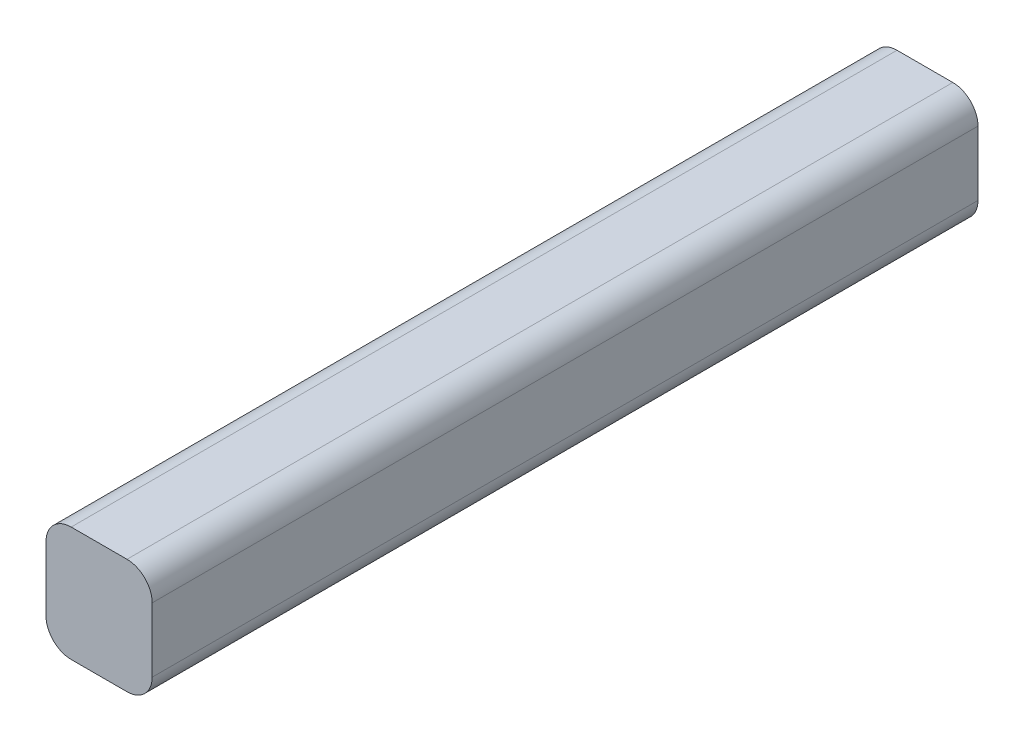
ISO-10303-21;
HEADER;
FILE_DESCRIPTION(('STEP AP214'),'2;1');
FILE_NAME('part.step','',(''),(''),'','','');
FILE_SCHEMA(('AUTOMOTIVE_DESIGN { 1 0 10303 214 1 1 1 1 }'));
ENDSEC;
DATA;
#1=APPLICATION_CONTEXT('core data for automotive mechanical design processes');
#2=APPLICATION_PROTOCOL_DEFINITION('international standard','automotive_design',2000,#1);
#3=PRODUCT_CONTEXT('',#1,'mechanical');
#4=PRODUCT('Part','Part','',(#3));
#5=PRODUCT_RELATED_PRODUCT_CATEGORY('part','',(#4));
#6=PRODUCT_DEFINITION_FORMATION('','',#4);
#7=PRODUCT_DEFINITION_CONTEXT('part definition',#1,'design');
#8=PRODUCT_DEFINITION('design','',#6,#7);
#9=PRODUCT_DEFINITION_SHAPE('','',#8);
#10=(LENGTH_UNIT() NAMED_UNIT(*) SI_UNIT(.MILLI.,.METRE.));
#11=(NAMED_UNIT(*) PLANE_ANGLE_UNIT() SI_UNIT($,.RADIAN.));
#12=(NAMED_UNIT(*) SI_UNIT($,.STERADIAN.) SOLID_ANGLE_UNIT());
#13=UNCERTAINTY_MEASURE_WITH_UNIT(LENGTH_MEASURE(1.E-05),#10,'distance_accuracy_value','');
#14=(GEOMETRIC_REPRESENTATION_CONTEXT(3) GLOBAL_UNCERTAINTY_ASSIGNED_CONTEXT((#13)) GLOBAL_UNIT_ASSIGNED_CONTEXT((#10,
#11,#12)) REPRESENTATION_CONTEXT('',''));
#15=CARTESIAN_POINT('',(0.,0.,0.));
#16=DIRECTION('',(0.,0.,1.));
#17=DIRECTION('',(1.,0.,0.));
#18=AXIS2_PLACEMENT_3D('',#15,#16,#17);
#19=CARTESIAN_POINT('',(-19.39,22.78,328.));
#20=DIRECTION('',(0.,-1.,0.));
#21=DIRECTION('',(0.,0.,-1.));
#22=AXIS2_PLACEMENT_3D('',#19,#20,#21);
#23=PLANE('',#22);
#24=DIRECTION('',(-1.,0.,0.));
#25=VECTOR('',#24,1.);
#26=CARTESIAN_POINT('',(-19.39,22.78,0.));
#27=LINE('',#26,#25);
#28=CARTESIAN_POINT('',(12.78,22.78,0.));
#29=VERTEX_POINT('',#28);
#30=CARTESIAN_POINT('',(-9.39,22.78,0.));
#31=VERTEX_POINT('',#30);
#32=EDGE_CURVE('E146',#29,#31,#27,.T.);
#33=ORIENTED_EDGE('',*,*,#32,.T.);
#34=DIRECTION('',(0.,0.,-1.));
#35=VECTOR('',#34,1.);
#36=CARTESIAN_POINT('',(-9.39,22.78,328.));
#37=LINE('',#36,#35);
#38=CARTESIAN_POINT('',(-9.39,22.78,328.));
#39=VERTEX_POINT('',#38);
#40=EDGE_CURVE('E180',#31,#39,#37,.F.);
#41=ORIENTED_EDGE('',*,*,#40,.T.);
#42=DIRECTION('',(-1.,0.,0.));
#43=VECTOR('',#42,1.);
#44=CARTESIAN_POINT('',(-19.39,22.78,328.));
#45=LINE('',#44,#43);
#46=CARTESIAN_POINT('',(12.78,22.78,328.));
#47=VERTEX_POINT('',#46);
#48=EDGE_CURVE('E144',#47,#39,#45,.T.);
#49=ORIENTED_EDGE('',*,*,#48,.F.);
#50=DIRECTION('',(0.,0.,-1.));
#51=VECTOR('',#50,1.);
#52=CARTESIAN_POINT('',(12.78,22.78,328.));
#53=LINE('',#52,#51);
#54=EDGE_CURVE('E176',#47,#29,#53,.T.);
#55=ORIENTED_EDGE('',*,*,#54,.T.);
#56=EDGE_LOOP('',(#33,#41,#49,#55));
#57=FACE_BOUND('',#56,.T.);
#58=ADVANCED_FACE('F45',(#57),#23,.F.);
#59=CARTESIAN_POINT('',(-19.39,-22.79,328.));
#60=DIRECTION('',(1.,0.,0.));
#61=DIRECTION('',(0.,0.,-1.));
#62=AXIS2_PLACEMENT_3D('',#59,#60,#61);
#63=PLANE('',#62);
#64=DIRECTION('',(0.,-1.,0.));
#65=VECTOR('',#64,1.);
#66=CARTESIAN_POINT('',(-19.39,-22.79,0.));
#67=LINE('',#66,#65);
#68=CARTESIAN_POINT('',(-19.39,12.78,0.));
#69=VERTEX_POINT('',#68);
#70=CARTESIAN_POINT('',(-19.39,-12.79,0.));
#71=VERTEX_POINT('',#70);
#72=EDGE_CURVE('E140',#69,#71,#67,.T.);
#73=ORIENTED_EDGE('',*,*,#72,.T.);
#74=DIRECTION('',(0.,0.,-1.));
#75=VECTOR('',#74,1.);
#76=CARTESIAN_POINT('',(-19.39,-12.79,328.));
#77=LINE('',#76,#75);
#78=CARTESIAN_POINT('',(-19.39,-12.79,328.));
#79=VERTEX_POINT('',#78);
#80=EDGE_CURVE('E116',#71,#79,#77,.F.);
#81=ORIENTED_EDGE('',*,*,#80,.T.);
#82=DIRECTION('',(0.,-1.,0.));
#83=VECTOR('',#82,1.);
#84=CARTESIAN_POINT('',(-19.39,-22.79,328.));
#85=LINE('',#84,#83);
#86=CARTESIAN_POINT('',(-19.39,12.78,328.));
#87=VERTEX_POINT('',#86);
#88=EDGE_CURVE('E199',#87,#79,#85,.T.);
#89=ORIENTED_EDGE('',*,*,#88,.F.);
#90=DIRECTION('',(0.,0.,-1.));
#91=VECTOR('',#90,1.);
#92=CARTESIAN_POINT('',(-19.39,12.78,328.));
#93=LINE('',#92,#91);
#94=EDGE_CURVE('E122',#87,#69,#93,.T.);
#95=ORIENTED_EDGE('',*,*,#94,.T.);
#96=EDGE_LOOP('',(#73,#81,#89,#95));
#97=FACE_BOUND('',#96,.T.);
#98=ADVANCED_FACE('F220',(#97),#63,.F.);
#99=CARTESIAN_POINT('',(22.78,-22.79,328.));
#100=DIRECTION('',(0.,1.,0.));
#101=DIRECTION('',(-1.,0.,0.));
#102=AXIS2_PLACEMENT_3D('',#99,#100,#101);
#103=PLANE('',#102);
#104=DIRECTION('',(1.,0.,0.));
#105=VECTOR('',#104,1.);
#106=CARTESIAN_POINT('',(22.78,-22.79,328.));
#107=LINE('',#106,#105);
#108=CARTESIAN_POINT('',(-9.38999999999998,-22.79,328.));
#109=VERTEX_POINT('',#108);
#110=CARTESIAN_POINT('',(12.78,-22.79,328.));
#111=VERTEX_POINT('',#110);
#112=EDGE_CURVE('E131',#109,#111,#107,.T.);
#113=ORIENTED_EDGE('',*,*,#112,.F.);
#114=DIRECTION('',(0.,0.,-1.));
#115=VECTOR('',#114,1.);
#116=CARTESIAN_POINT('',(-9.39,-22.79,328.));
#117=LINE('',#116,#115);
#118=CARTESIAN_POINT('',(-9.38999999999998,-22.79,0.));
#119=VERTEX_POINT('',#118);
#120=EDGE_CURVE('E115',#109,#119,#117,.T.);
#121=ORIENTED_EDGE('',*,*,#120,.T.);
#122=DIRECTION('',(1.,0.,0.));
#123=VECTOR('',#122,1.);
#124=CARTESIAN_POINT('',(22.78,-22.79,0.));
#125=LINE('',#124,#123);
#126=CARTESIAN_POINT('',(12.78,-22.79,0.));
#127=VERTEX_POINT('',#126);
#128=EDGE_CURVE('E129',#119,#127,#125,.T.);
#129=ORIENTED_EDGE('',*,*,#128,.T.);
#130=DIRECTION('',(0.,0.,-1.));
#131=VECTOR('',#130,1.);
#132=CARTESIAN_POINT('',(12.78,-22.79,328.));
#133=LINE('',#132,#131);
#134=EDGE_CURVE('E134',#127,#111,#133,.F.);
#135=ORIENTED_EDGE('',*,*,#134,.T.);
#136=EDGE_LOOP('',(#113,#121,#129,#135));
#137=FACE_BOUND('',#136,.T.);
#138=ADVANCED_FACE('F128',(#137),#103,.F.);
#139=CARTESIAN_POINT('',(22.78,22.78,328.));
#140=DIRECTION('',(-1.,0.,0.));
#141=DIRECTION('',(0.,-1.,0.));
#142=AXIS2_PLACEMENT_3D('',#139,#140,#141);
#143=PLANE('',#142);
#144=DIRECTION('',(0.,1.,0.));
#145=VECTOR('',#144,1.);
#146=CARTESIAN_POINT('',(22.78,22.78,0.));
#147=LINE('',#146,#145);
#148=CARTESIAN_POINT('',(22.78,-12.79,0.));
#149=VERTEX_POINT('',#148);
#150=CARTESIAN_POINT('',(22.78,12.78,0.));
#151=VERTEX_POINT('',#150);
#152=EDGE_CURVE('E139',#149,#151,#147,.T.);
#153=ORIENTED_EDGE('',*,*,#152,.T.);
#154=DIRECTION('',(0.,0.,-1.));
#155=VECTOR('',#154,1.);
#156=CARTESIAN_POINT('',(22.78,12.78,328.));
#157=LINE('',#156,#155);
#158=CARTESIAN_POINT('',(22.78,12.78,328.));
#159=VERTEX_POINT('',#158);
#160=EDGE_CURVE('E11',#151,#159,#157,.F.);
#161=ORIENTED_EDGE('',*,*,#160,.T.);
#162=DIRECTION('',(0.,1.,0.));
#163=VECTOR('',#162,1.);
#164=CARTESIAN_POINT('',(22.78,22.78,328.));
#165=LINE('',#164,#163);
#166=CARTESIAN_POINT('',(22.78,-12.79,328.));
#167=VERTEX_POINT('',#166);
#168=EDGE_CURVE('E151',#167,#159,#165,.T.);
#169=ORIENTED_EDGE('',*,*,#168,.F.);
#170=DIRECTION('',(0.,0.,-1.));
#171=VECTOR('',#170,1.);
#172=CARTESIAN_POINT('',(22.78,-12.79,328.));
#173=LINE('',#172,#171);
#174=EDGE_CURVE('E54',#167,#149,#173,.T.);
#175=ORIENTED_EDGE('',*,*,#174,.T.);
#176=EDGE_LOOP('',(#153,#161,#169,#175));
#177=FACE_BOUND('',#176,.T.);
#178=ADVANCED_FACE('F185',(#177),#143,.F.);
#179=CARTESIAN_POINT('',(0.,0.,328.));
#180=DIRECTION('',(0.,0.,-1.));
#181=DIRECTION('',(-1.,0.,0.));
#182=AXIS2_PLACEMENT_3D('',#179,#180,#181);
#183=PLANE('',#182);
#184=ORIENTED_EDGE('',*,*,#88,.T.);
#185=CARTESIAN_POINT('',(-9.39,-12.79,328.));
#186=DIRECTION('',(0.,0.,-1.));
#187=DIRECTION('',(-1.,0.,0.));
#188=AXIS2_PLACEMENT_3D('',#185,#186,#187);
#189=CIRCLE('',#188,10.);
#190=EDGE_CURVE('E173',#79,#109,#189,.F.);
#191=ORIENTED_EDGE('',*,*,#190,.T.);
#192=ORIENTED_EDGE('',*,*,#112,.T.);
#193=CARTESIAN_POINT('',(12.78,-12.79,328.));
#194=DIRECTION('',(0.,0.,-1.));
#195=DIRECTION('',(-1.,0.,0.));
#196=AXIS2_PLACEMENT_3D('',#193,#194,#195);
#197=CIRCLE('',#196,10.);
#198=EDGE_CURVE('E66',#111,#167,#197,.F.);
#199=ORIENTED_EDGE('',*,*,#198,.T.);
#200=ORIENTED_EDGE('',*,*,#168,.T.);
#201=CARTESIAN_POINT('',(12.78,12.78,328.));
#202=DIRECTION('',(0.,0.,-1.));
#203=DIRECTION('',(-1.,0.,0.));
#204=AXIS2_PLACEMENT_3D('',#201,#202,#203);
#205=CIRCLE('',#204,10.);
#206=EDGE_CURVE('E167',#159,#47,#205,.F.);
#207=ORIENTED_EDGE('',*,*,#206,.T.);
#208=ORIENTED_EDGE('',*,*,#48,.T.);
#209=CARTESIAN_POINT('',(-9.39,12.78,328.));
#210=DIRECTION('',(0.,0.,-1.));
#211=DIRECTION('',(-1.,0.,0.));
#212=AXIS2_PLACEMENT_3D('',#209,#210,#211);
#213=CIRCLE('',#212,10.);
#214=EDGE_CURVE('E170',#39,#87,#213,.F.);
#215=ORIENTED_EDGE('',*,*,#214,.T.);
#216=EDGE_LOOP('',(#184,#191,#192,#199,#200,#207,#208,#215));
#217=FACE_BOUND('',#216,.T.);
#218=ADVANCED_FACE('F209',(#217),#183,.F.);
#219=CARTESIAN_POINT('',(0.,0.,0.));
#220=DIRECTION('',(0.,0.,-1.));
#221=DIRECTION('',(-1.,0.,0.));
#222=AXIS2_PLACEMENT_3D('',#219,#220,#221);
#223=PLANE('',#222);
#224=ORIENTED_EDGE('',*,*,#128,.F.);
#225=CARTESIAN_POINT('',(-9.39,-12.79,0.));
#226=DIRECTION('',(0.,0.,-1.));
#227=DIRECTION('',(-1.,0.,0.));
#228=AXIS2_PLACEMENT_3D('',#225,#226,#227);
#229=CIRCLE('',#228,10.);
#230=EDGE_CURVE('E111',#119,#71,#229,.T.);
#231=ORIENTED_EDGE('',*,*,#230,.T.);
#232=ORIENTED_EDGE('',*,*,#72,.F.);
#233=CARTESIAN_POINT('',(-9.39,12.78,0.));
#234=DIRECTION('',(0.,0.,-1.));
#235=DIRECTION('',(-1.,0.,0.));
#236=AXIS2_PLACEMENT_3D('',#233,#234,#235);
#237=CIRCLE('',#236,10.);
#238=EDGE_CURVE('E123',#69,#31,#237,.T.);
#239=ORIENTED_EDGE('',*,*,#238,.T.);
#240=ORIENTED_EDGE('',*,*,#32,.F.);
#241=CARTESIAN_POINT('',(12.78,12.78,0.));
#242=DIRECTION('',(0.,0.,-1.));
#243=DIRECTION('',(-1.,0.,0.));
#244=AXIS2_PLACEMENT_3D('',#241,#242,#243);
#245=CIRCLE('',#244,10.);
#246=EDGE_CURVE('E155',#29,#151,#245,.T.);
#247=ORIENTED_EDGE('',*,*,#246,.T.);
#248=ORIENTED_EDGE('',*,*,#152,.F.);
#249=CARTESIAN_POINT('',(12.78,-12.79,0.));
#250=DIRECTION('',(0.,0.,-1.));
#251=DIRECTION('',(-1.,0.,0.));
#252=AXIS2_PLACEMENT_3D('',#249,#250,#251);
#253=CIRCLE('',#252,10.);
#254=EDGE_CURVE('E133',#149,#127,#253,.T.);
#255=ORIENTED_EDGE('',*,*,#254,.T.);
#256=EDGE_LOOP('',(#224,#231,#232,#239,#240,#247,#248,#255));
#257=FACE_BOUND('',#256,.T.);
#258=ADVANCED_FACE('F136',(#257),#223,.T.);
#259=CARTESIAN_POINT('',(-9.39,-12.79,328.));
#260=DIRECTION('',(0.,0.,-1.));
#261=DIRECTION('',(-1.,0.,0.));
#262=AXIS2_PLACEMENT_3D('',#259,#260,#261);
#263=CYLINDRICAL_SURFACE('',#262,10.);
#264=ORIENTED_EDGE('',*,*,#190,.F.);
#265=ORIENTED_EDGE('',*,*,#80,.F.);
#266=ORIENTED_EDGE('',*,*,#230,.F.);
#267=ORIENTED_EDGE('',*,*,#120,.F.);
#268=EDGE_LOOP('',(#264,#265,#266,#267));
#269=FACE_BOUND('',#268,.T.);
#270=ADVANCED_FACE('F114',(#269),#263,.T.);
#271=CARTESIAN_POINT('',(-9.39,12.78,328.));
#272=DIRECTION('',(0.,0.,-1.));
#273=DIRECTION('',(-1.,0.,0.));
#274=AXIS2_PLACEMENT_3D('',#271,#272,#273);
#275=CYLINDRICAL_SURFACE('',#274,10.);
#276=ORIENTED_EDGE('',*,*,#214,.F.);
#277=ORIENTED_EDGE('',*,*,#40,.F.);
#278=ORIENTED_EDGE('',*,*,#238,.F.);
#279=ORIENTED_EDGE('',*,*,#94,.F.);
#280=EDGE_LOOP('',(#276,#277,#278,#279));
#281=FACE_BOUND('',#280,.T.);
#282=ADVANCED_FACE('F231',(#281),#275,.T.);
#283=CARTESIAN_POINT('',(12.78,12.78,328.));
#284=DIRECTION('',(0.,0.,-1.));
#285=DIRECTION('',(-1.,0.,0.));
#286=AXIS2_PLACEMENT_3D('',#283,#284,#285);
#287=CYLINDRICAL_SURFACE('',#286,10.);
#288=ORIENTED_EDGE('',*,*,#206,.F.);
#289=ORIENTED_EDGE('',*,*,#160,.F.);
#290=ORIENTED_EDGE('',*,*,#246,.F.);
#291=ORIENTED_EDGE('',*,*,#54,.F.);
#292=EDGE_LOOP('',(#288,#289,#290,#291));
#293=FACE_BOUND('',#292,.T.);
#294=ADVANCED_FACE('F192',(#293),#287,.T.);
#295=CARTESIAN_POINT('',(12.78,-12.79,328.));
#296=DIRECTION('',(0.,0.,-1.));
#297=DIRECTION('',(-1.,0.,0.));
#298=AXIS2_PLACEMENT_3D('',#295,#296,#297);
#299=CYLINDRICAL_SURFACE('',#298,10.);
#300=ORIENTED_EDGE('',*,*,#198,.F.);
#301=ORIENTED_EDGE('',*,*,#134,.F.);
#302=ORIENTED_EDGE('',*,*,#254,.F.);
#303=ORIENTED_EDGE('',*,*,#174,.F.);
#304=EDGE_LOOP('',(#300,#301,#302,#303));
#305=FACE_BOUND('',#304,.T.);
#306=ADVANCED_FACE('F47',(#305),#299,.T.);
#307=CLOSED_SHELL('',(#58,#98,#138,#178,#218,#258,#270,#282,#294,#306));
#308=MANIFOLD_SOLID_BREP('B2',#307);
#309=ADVANCED_BREP_SHAPE_REPRESENTATION('',(#18,#308),#14);
#310=SHAPE_DEFINITION_REPRESENTATION(#9,#309);
ENDSEC;
END-ISO-10303-21;
